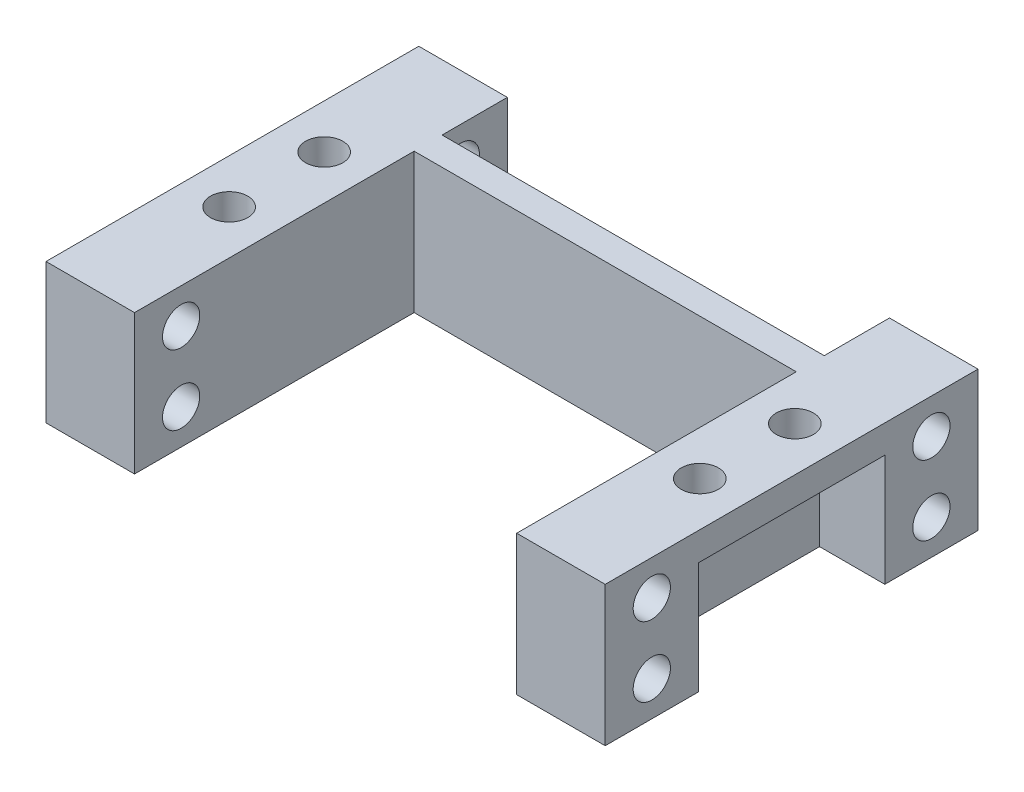
ISO-10303-21;
HEADER;
FILE_DESCRIPTION(('STEP AP214'),'2;1');
FILE_NAME('part.step','',(''),(''),'','','');
FILE_SCHEMA(('AUTOMOTIVE_DESIGN { 1 0 10303 214 1 1 1 1 }'));
ENDSEC;
DATA;
#1=APPLICATION_CONTEXT('core data for automotive mechanical design processes');
#2=APPLICATION_PROTOCOL_DEFINITION('international standard','automotive_design',2000,#1);
#3=PRODUCT_CONTEXT('',#1,'mechanical');
#4=PRODUCT('Part','Part','',(#3));
#5=PRODUCT_RELATED_PRODUCT_CATEGORY('part','',(#4));
#6=PRODUCT_DEFINITION_FORMATION('','',#4);
#7=PRODUCT_DEFINITION_CONTEXT('part definition',#1,'design');
#8=PRODUCT_DEFINITION('design','',#6,#7);
#9=PRODUCT_DEFINITION_SHAPE('','',#8);
#10=(LENGTH_UNIT() NAMED_UNIT(*) SI_UNIT(.MILLI.,.METRE.));
#11=(NAMED_UNIT(*) PLANE_ANGLE_UNIT() SI_UNIT($,.RADIAN.));
#12=(NAMED_UNIT(*) SI_UNIT($,.STERADIAN.) SOLID_ANGLE_UNIT());
#13=UNCERTAINTY_MEASURE_WITH_UNIT(LENGTH_MEASURE(1.E-05),#10,'distance_accuracy_value','');
#14=(GEOMETRIC_REPRESENTATION_CONTEXT(3) GLOBAL_UNCERTAINTY_ASSIGNED_CONTEXT((#13)) GLOBAL_UNIT_ASSIGNED_CONTEXT((#10,
#11,#12)) REPRESENTATION_CONTEXT('',''));
#15=CARTESIAN_POINT('',(0.,0.,0.));
#16=DIRECTION('',(0.,0.,1.));
#17=DIRECTION('',(1.,0.,0.));
#18=AXIS2_PLACEMENT_3D('',#15,#16,#17);
#19=CARTESIAN_POINT('',(0.,0.,0.));
#20=DIRECTION('',(0.,0.,-1.));
#21=DIRECTION('',(-1.,0.,0.));
#22=AXIS2_PLACEMENT_3D('',#19,#20,#21);
#23=PLANE('',#22);
#24=DIRECTION('',(0.,-1.,0.));
#25=VECTOR('',#24,1.);
#26=CARTESIAN_POINT('',(43.5,0.,0.));
#27=LINE('',#26,#25);
#28=CARTESIAN_POINT('',(43.5,15.,0.));
#29=VERTEX_POINT('',#28);
#30=CARTESIAN_POINT('',(43.5,11.25,0.));
#31=VERTEX_POINT('',#30);
#32=EDGE_CURVE('E11',#29,#31,#27,.T.);
#33=ORIENTED_EDGE('',*,*,#32,.T.);
#34=CARTESIAN_POINT('',(43.5,3.75,0.));
#35=VERTEX_POINT('',#34);
#36=EDGE_CURVE('E47',#31,#35,#27,.T.);
#37=ORIENTED_EDGE('',*,*,#36,.T.);
#38=CARTESIAN_POINT('',(43.5,0.,0.));
#39=VERTEX_POINT('',#38);
#40=EDGE_CURVE('E49',#35,#39,#27,.T.);
#41=ORIENTED_EDGE('',*,*,#40,.T.);
#42=DIRECTION('',(1.,0.,0.));
#43=VECTOR('',#42,1.);
#44=CARTESIAN_POINT('',(0.,0.,0.));
#45=LINE('',#44,#43);
#46=CARTESIAN_POINT('',(2.5,0.,0.));
#47=VERTEX_POINT('',#46);
#48=EDGE_CURVE('E381',#47,#39,#45,.T.);
#49=ORIENTED_EDGE('',*,*,#48,.F.);
#50=DIRECTION('',(0.,-1.,0.));
#51=VECTOR('',#50,1.);
#52=CARTESIAN_POINT('',(2.5,0.,0.));
#53=LINE('',#52,#51);
#54=CARTESIAN_POINT('',(2.5,3.75,0.));
#55=VERTEX_POINT('',#54);
#56=EDGE_CURVE('E395',#55,#47,#53,.T.);
#57=ORIENTED_EDGE('',*,*,#56,.F.);
#58=CARTESIAN_POINT('',(2.5,11.25,0.));
#59=VERTEX_POINT('',#58);
#60=EDGE_CURVE('E407',#59,#55,#53,.T.);
#61=ORIENTED_EDGE('',*,*,#60,.F.);
#62=CARTESIAN_POINT('',(2.5,15.,0.));
#63=VERTEX_POINT('',#62);
#64=EDGE_CURVE('E404',#63,#59,#53,.T.);
#65=ORIENTED_EDGE('',*,*,#64,.F.);
#66=DIRECTION('',(-1.,0.,0.));
#67=VECTOR('',#66,1.);
#68=CARTESIAN_POINT('',(0.,15.,0.));
#69=LINE('',#68,#67);
#70=EDGE_CURVE('E385',#29,#63,#69,.T.);
#71=ORIENTED_EDGE('',*,*,#70,.F.);
#72=EDGE_LOOP('',(#33,#37,#41,#49,#57,#61,#65,#71));
#73=FACE_BOUND('',#72,.T.);
#74=ADVANCED_FACE('F38',(#73),#23,.T.);
#75=CARTESIAN_POINT('',(0.,0.,3.));
#76=DIRECTION('',(1.,0.,0.));
#77=DIRECTION('',(0.,0.,-1.));
#78=AXIS2_PLACEMENT_3D('',#75,#76,#77);
#79=PLANE('',#78);
#80=DIRECTION('',(0.,0.,1.));
#81=VECTOR('',#80,1.);
#82=CARTESIAN_POINT('',(0.,12.,23.));
#83=LINE('',#82,#81);
#84=CARTESIAN_POINT('',(0.,12.,3.));
#85=VERTEX_POINT('',#84);
#86=CARTESIAN_POINT('',(0.,12.,23.));
#87=VERTEX_POINT('',#86);
#88=EDGE_CURVE('E359',#85,#87,#83,.T.);
#89=ORIENTED_EDGE('',*,*,#88,.F.);
#90=DIRECTION('',(0.,-1.,0.));
#91=VECTOR('',#90,1.);
#92=CARTESIAN_POINT('',(0.,0.,3.));
#93=LINE('',#92,#91);
#94=CARTESIAN_POINT('',(0.,0.,3.));
#95=VERTEX_POINT('',#94);
#96=EDGE_CURVE('E254',#85,#95,#93,.T.);
#97=ORIENTED_EDGE('',*,*,#96,.T.);
#98=DIRECTION('',(0.,0.,-1.));
#99=VECTOR('',#98,1.);
#100=CARTESIAN_POINT('',(0.,0.,3.));
#101=LINE('',#100,#99);
#102=CARTESIAN_POINT('',(0.,0.,23.));
#103=VERTEX_POINT('',#102);
#104=EDGE_CURVE('E392',#103,#95,#101,.T.);
#105=ORIENTED_EDGE('',*,*,#104,.F.);
#106=DIRECTION('',(0.,-1.,0.));
#107=VECTOR('',#106,1.);
#108=CARTESIAN_POINT('',(0.,0.,23.));
#109=LINE('',#108,#107);
#110=EDGE_CURVE('E371',#87,#103,#109,.T.);
#111=ORIENTED_EDGE('',*,*,#110,.F.);
#112=EDGE_LOOP('',(#89,#97,#105,#111));
#113=FACE_BOUND('',#112,.T.);
#114=ADVANCED_FACE('F40',(#113),#79,.F.);
#115=CARTESIAN_POINT('',(0.,0.,3.));
#116=DIRECTION('',(0.,0.,-1.));
#117=DIRECTION('',(-1.,0.,0.));
#118=AXIS2_PLACEMENT_3D('',#115,#116,#117);
#119=PLANE('',#118);
#120=DIRECTION('',(1.,0.,0.));
#121=VECTOR('',#120,1.);
#122=CARTESIAN_POINT('',(0.,0.,3.));
#123=LINE('',#122,#121);
#124=CARTESIAN_POINT('',(2.5,0.,3.));
#125=VERTEX_POINT('',#124);
#126=CARTESIAN_POINT('',(43.5,0.,3.));
#127=VERTEX_POINT('',#126);
#128=EDGE_CURVE('E382',#125,#127,#123,.T.);
#129=ORIENTED_EDGE('',*,*,#128,.T.);
#130=DIRECTION('',(0.,1.,0.));
#131=VECTOR('',#130,1.);
#132=CARTESIAN_POINT('',(43.5,0.,3.));
#133=LINE('',#132,#131);
#134=CARTESIAN_POINT('',(43.5,15.,3.));
#135=VERTEX_POINT('',#134);
#136=EDGE_CURVE('E338',#127,#135,#133,.T.);
#137=ORIENTED_EDGE('',*,*,#136,.T.);
#138=DIRECTION('',(-1.,0.,0.));
#139=VECTOR('',#138,1.);
#140=CARTESIAN_POINT('',(0.,15.,3.));
#141=LINE('',#140,#139);
#142=CARTESIAN_POINT('',(2.5,15.,3.));
#143=VERTEX_POINT('',#142);
#144=EDGE_CURVE('E384',#135,#143,#141,.T.);
#145=ORIENTED_EDGE('',*,*,#144,.T.);
#146=DIRECTION('',(0.,1.,0.));
#147=VECTOR('',#146,1.);
#148=CARTESIAN_POINT('',(2.5,0.,3.));
#149=LINE('',#148,#147);
#150=EDGE_CURVE('E370',#125,#143,#149,.T.);
#151=ORIENTED_EDGE('',*,*,#150,.F.);
#152=EDGE_LOOP('',(#129,#137,#145,#151));
#153=FACE_BOUND('',#152,.T.);
#154=ADVANCED_FACE('F458',(#153),#119,.F.);
#155=CARTESIAN_POINT('',(0.,0.,3.));
#156=DIRECTION('',(0.,1.,0.));
#157=DIRECTION('',(0.,0.,1.));
#158=AXIS2_PLACEMENT_3D('',#155,#156,#157);
#159=PLANE('',#158);
#160=DIRECTION('',(0.,0.,-1.));
#161=VECTOR('',#160,1.);
#162=CARTESIAN_POINT('',(43.5,0.,23.));
#163=LINE('',#162,#161);
#164=CARTESIAN_POINT('',(43.5,0.,33.));
#165=VERTEX_POINT('',#164);
#166=EDGE_CURVE('E341',#165,#127,#163,.T.);
#167=ORIENTED_EDGE('',*,*,#166,.T.);
#168=ORIENTED_EDGE('',*,*,#128,.F.);
#169=DIRECTION('',(0.,0.,-1.));
#170=VECTOR('',#169,1.);
#171=CARTESIAN_POINT('',(2.5,0.,23.));
#172=LINE('',#171,#170);
#173=CARTESIAN_POINT('',(2.5,0.,33.));
#174=VERTEX_POINT('',#173);
#175=EDGE_CURVE('E378',#174,#125,#172,.T.);
#176=ORIENTED_EDGE('',*,*,#175,.F.);
#177=DIRECTION('',(1.,0.,0.));
#178=VECTOR('',#177,1.);
#179=CARTESIAN_POINT('',(2.5,0.,33.));
#180=LINE('',#179,#178);
#181=CARTESIAN_POINT('',(-7.00000000000001,0.,33.));
#182=VERTEX_POINT('',#181);
#183=EDGE_CURVE('E310',#182,#174,#180,.T.);
#184=ORIENTED_EDGE('',*,*,#183,.F.);
#185=DIRECTION('',(0.,0.,-1.));
#186=VECTOR('',#185,1.);
#187=CARTESIAN_POINT('',(-7.00000000000001,0.,33.));
#188=LINE('',#187,#186);
#189=CARTESIAN_POINT('',(-7.00000000000001,0.,23.));
#190=VERTEX_POINT('',#189);
#191=EDGE_CURVE('E313',#182,#190,#188,.T.);
#192=ORIENTED_EDGE('',*,*,#191,.T.);
#193=DIRECTION('',(1.,0.,0.));
#194=VECTOR('',#193,1.);
#195=CARTESIAN_POINT('',(2.5,0.,23.));
#196=LINE('',#195,#194);
#197=EDGE_CURVE('E305',#190,#103,#196,.T.);
#198=ORIENTED_EDGE('',*,*,#197,.T.);
#199=ORIENTED_EDGE('',*,*,#104,.T.);
#200=DIRECTION('',(1.,0.,0.));
#201=VECTOR('',#200,1.);
#202=CARTESIAN_POINT('',(2.5,0.,3.));
#203=LINE('',#202,#201);
#204=CARTESIAN_POINT('',(-7.00000000000001,0.,3.));
#205=VERTEX_POINT('',#204);
#206=EDGE_CURVE('E242',#205,#95,#203,.T.);
#207=ORIENTED_EDGE('',*,*,#206,.F.);
#208=DIRECTION('',(0.,0.,1.));
#209=VECTOR('',#208,1.);
#210=CARTESIAN_POINT('',(-7.00000000000001,0.,-7.));
#211=LINE('',#210,#209);
#212=CARTESIAN_POINT('',(-7.00000000000001,0.,-7.));
#213=VERTEX_POINT('',#212);
#214=EDGE_CURVE('E248',#213,#205,#211,.T.);
#215=ORIENTED_EDGE('',*,*,#214,.F.);
#216=DIRECTION('',(1.,0.,0.));
#217=VECTOR('',#216,1.);
#218=CARTESIAN_POINT('',(2.5,0.,-7.));
#219=LINE('',#218,#217);
#220=CARTESIAN_POINT('',(2.5,0.,-7.));
#221=VERTEX_POINT('',#220);
#222=EDGE_CURVE('E231',#213,#221,#219,.T.);
#223=ORIENTED_EDGE('',*,*,#222,.T.);
#224=DIRECTION('',(0.,0.,1.));
#225=VECTOR('',#224,1.);
#226=CARTESIAN_POINT('',(2.5,0.,-7.));
#227=LINE('',#226,#225);
#228=EDGE_CURVE('E251',#221,#47,#227,.T.);
#229=ORIENTED_EDGE('',*,*,#228,.T.);
#230=ORIENTED_EDGE('',*,*,#48,.T.);
#231=DIRECTION('',(0.,0.,1.));
#232=VECTOR('',#231,1.);
#233=CARTESIAN_POINT('',(43.5,0.,-7.));
#234=LINE('',#233,#232);
#235=CARTESIAN_POINT('',(43.5,0.,-7.));
#236=VERTEX_POINT('',#235);
#237=EDGE_CURVE('E218',#236,#39,#234,.T.);
#238=ORIENTED_EDGE('',*,*,#237,.F.);
#239=DIRECTION('',(-1.,0.,0.));
#240=VECTOR('',#239,1.);
#241=CARTESIAN_POINT('',(43.5,0.,-7.));
#242=LINE('',#241,#240);
#243=CARTESIAN_POINT('',(53.,0.,-7.));
#244=VERTEX_POINT('',#243);
#245=EDGE_CURVE('E203',#244,#236,#242,.T.);
#246=ORIENTED_EDGE('',*,*,#245,.F.);
#247=DIRECTION('',(0.,0.,1.));
#248=VECTOR('',#247,1.);
#249=CARTESIAN_POINT('',(53.,0.,-7.));
#250=LINE('',#249,#248);
#251=CARTESIAN_POINT('',(53.,0.,3.));
#252=VERTEX_POINT('',#251);
#253=EDGE_CURVE('E213',#244,#252,#250,.T.);
#254=ORIENTED_EDGE('',*,*,#253,.T.);
#255=DIRECTION('',(-1.,0.,0.));
#256=VECTOR('',#255,1.);
#257=CARTESIAN_POINT('',(43.5,0.,3.));
#258=LINE('',#257,#256);
#259=CARTESIAN_POINT('',(46.,0.,3.));
#260=VERTEX_POINT('',#259);
#261=EDGE_CURVE('E207',#252,#260,#258,.T.);
#262=ORIENTED_EDGE('',*,*,#261,.T.);
#263=DIRECTION('',(0.,0.,-1.));
#264=VECTOR('',#263,1.);
#265=CARTESIAN_POINT('',(46.,0.,3.));
#266=LINE('',#265,#264);
#267=CARTESIAN_POINT('',(46.,0.,23.));
#268=VERTEX_POINT('',#267);
#269=EDGE_CURVE('E387',#268,#260,#266,.T.);
#270=ORIENTED_EDGE('',*,*,#269,.F.);
#271=DIRECTION('',(-1.,0.,0.));
#272=VECTOR('',#271,1.);
#273=CARTESIAN_POINT('',(43.5,0.,23.));
#274=LINE('',#273,#272);
#275=CARTESIAN_POINT('',(53.,0.,23.));
#276=VERTEX_POINT('',#275);
#277=EDGE_CURVE('E269',#276,#268,#274,.T.);
#278=ORIENTED_EDGE('',*,*,#277,.F.);
#279=DIRECTION('',(0.,0.,-1.));
#280=VECTOR('',#279,1.);
#281=CARTESIAN_POINT('',(53.,0.,33.));
#282=LINE('',#281,#280);
#283=CARTESIAN_POINT('',(53.,0.,33.));
#284=VERTEX_POINT('',#283);
#285=EDGE_CURVE('E282',#284,#276,#282,.T.);
#286=ORIENTED_EDGE('',*,*,#285,.F.);
#287=DIRECTION('',(-1.,0.,0.));
#288=VECTOR('',#287,1.);
#289=CARTESIAN_POINT('',(43.5,0.,33.));
#290=LINE('',#289,#288);
#291=EDGE_CURVE('E273',#284,#165,#290,.T.);
#292=ORIENTED_EDGE('',*,*,#291,.T.);
#293=EDGE_LOOP('',(#167,#168,#176,#184,#192,#198,#199,#207,#215,#223,#229,#230,#238,#246,#254,
#262,#270,#278,#286,#292));
#294=FACE_BOUND('',#293,.T.);
#295=ADVANCED_FACE('F428',(#294),#159,.F.);
#296=CARTESIAN_POINT('',(46.,0.,3.));
#297=DIRECTION('',(-1.,0.,0.));
#298=DIRECTION('',(0.,0.,1.));
#299=AXIS2_PLACEMENT_3D('',#296,#297,#298);
#300=PLANE('',#299);
#301=ORIENTED_EDGE('',*,*,#269,.T.);
#302=DIRECTION('',(0.,1.,0.));
#303=VECTOR('',#302,1.);
#304=CARTESIAN_POINT('',(46.,0.,3.));
#305=LINE('',#304,#303);
#306=CARTESIAN_POINT('',(46.,12.,3.));
#307=VERTEX_POINT('',#306);
#308=EDGE_CURVE('E212',#260,#307,#305,.T.);
#309=ORIENTED_EDGE('',*,*,#308,.T.);
#310=DIRECTION('',(0.,0.,1.));
#311=VECTOR('',#310,1.);
#312=CARTESIAN_POINT('',(46.,12.,23.));
#313=LINE('',#312,#311);
#314=CARTESIAN_POINT('',(46.,12.,23.));
#315=VERTEX_POINT('',#314);
#316=EDGE_CURVE('E328',#307,#315,#313,.T.);
#317=ORIENTED_EDGE('',*,*,#316,.T.);
#318=DIRECTION('',(0.,-1.,0.));
#319=VECTOR('',#318,1.);
#320=CARTESIAN_POINT('',(46.,0.,23.));
#321=LINE('',#320,#319);
#322=EDGE_CURVE('E339',#315,#268,#321,.T.);
#323=ORIENTED_EDGE('',*,*,#322,.T.);
#324=EDGE_LOOP('',(#301,#309,#317,#323));
#325=FACE_BOUND('',#324,.T.);
#326=ADVANCED_FACE('F481',(#325),#300,.F.);
#327=CARTESIAN_POINT('',(0.,15.,3.));
#328=DIRECTION('',(0.,-1.,0.));
#329=DIRECTION('',(0.,0.,-1.));
#330=AXIS2_PLACEMENT_3D('',#327,#328,#329);
#331=PLANE('',#330);
#332=DIRECTION('',(0.,0.,1.));
#333=VECTOR('',#332,1.);
#334=CARTESIAN_POINT('',(43.5,15.,-7.));
#335=LINE('',#334,#333);
#336=CARTESIAN_POINT('',(43.5,15.,-7.));
#337=VERTEX_POINT('',#336);
#338=EDGE_CURVE('E192',#337,#29,#335,.T.);
#339=ORIENTED_EDGE('',*,*,#338,.T.);
#340=ORIENTED_EDGE('',*,*,#70,.T.);
#341=DIRECTION('',(0.,0.,1.));
#342=VECTOR('',#341,1.);
#343=CARTESIAN_POINT('',(2.5,15.,-7.));
#344=LINE('',#343,#342);
#345=CARTESIAN_POINT('',(2.5,15.,-7.));
#346=VERTEX_POINT('',#345);
#347=EDGE_CURVE('E241',#346,#63,#344,.T.);
#348=ORIENTED_EDGE('',*,*,#347,.F.);
#349=DIRECTION('',(-1.,0.,0.));
#350=VECTOR('',#349,1.);
#351=CARTESIAN_POINT('',(2.5,15.,-7.));
#352=LINE('',#351,#350);
#353=CARTESIAN_POINT('',(-7.00000000000001,15.,-7.));
#354=VERTEX_POINT('',#353);
#355=EDGE_CURVE('E238',#346,#354,#352,.T.);
#356=ORIENTED_EDGE('',*,*,#355,.T.);
#357=DIRECTION('',(0.,0.,-1.));
#358=VECTOR('',#357,1.);
#359=CARTESIAN_POINT('',(-7.,15.,23.));
#360=LINE('',#359,#358);
#361=CARTESIAN_POINT('',(-7.00000000000001,15.,33.));
#362=VERTEX_POINT('',#361);
#363=EDGE_CURVE('E356',#362,#354,#360,.T.);
#364=ORIENTED_EDGE('',*,*,#363,.F.);
#365=DIRECTION('',(-1.,0.,0.));
#366=VECTOR('',#365,1.);
#367=CARTESIAN_POINT('',(2.5,15.,33.));
#368=LINE('',#367,#366);
#369=CARTESIAN_POINT('',(2.5,15.,33.));
#370=VERTEX_POINT('',#369);
#371=EDGE_CURVE('E304',#370,#362,#368,.T.);
#372=ORIENTED_EDGE('',*,*,#371,.F.);
#373=DIRECTION('',(0.,0.,-1.));
#374=VECTOR('',#373,1.);
#375=CARTESIAN_POINT('',(2.5,15.,23.));
#376=LINE('',#375,#374);
#377=EDGE_CURVE('E373',#370,#143,#376,.T.);
#378=ORIENTED_EDGE('',*,*,#377,.T.);
#379=ORIENTED_EDGE('',*,*,#144,.F.);
#380=DIRECTION('',(0.,0.,-1.));
#381=VECTOR('',#380,1.);
#382=CARTESIAN_POINT('',(43.5,15.,23.));
#383=LINE('',#382,#381);
#384=CARTESIAN_POINT('',(43.5,15.,33.));
#385=VERTEX_POINT('',#384);
#386=EDGE_CURVE('E346',#385,#135,#383,.T.);
#387=ORIENTED_EDGE('',*,*,#386,.F.);
#388=DIRECTION('',(1.,0.,0.));
#389=VECTOR('',#388,1.);
#390=CARTESIAN_POINT('',(43.5,15.,33.));
#391=LINE('',#390,#389);
#392=CARTESIAN_POINT('',(53.,15.,33.));
#393=VERTEX_POINT('',#392);
#394=EDGE_CURVE('E280',#385,#393,#391,.T.);
#395=ORIENTED_EDGE('',*,*,#394,.T.);
#396=DIRECTION('',(0.,0.,-1.));
#397=VECTOR('',#396,1.);
#398=CARTESIAN_POINT('',(53.,15.,23.));
#399=LINE('',#398,#397);
#400=CARTESIAN_POINT('',(53.,15.,-7.));
#401=VERTEX_POINT('',#400);
#402=EDGE_CURVE('E194',#393,#401,#399,.T.);
#403=ORIENTED_EDGE('',*,*,#402,.T.);
#404=DIRECTION('',(1.,0.,0.));
#405=VECTOR('',#404,1.);
#406=CARTESIAN_POINT('',(43.5,15.,-7.));
#407=LINE('',#406,#405);
#408=EDGE_CURVE('E187',#337,#401,#407,.T.);
#409=ORIENTED_EDGE('',*,*,#408,.F.);
#410=EDGE_LOOP('',(#339,#340,#348,#356,#364,#372,#378,#379,#387,#395,#403,#409));
#411=FACE_BOUND('',#410,.T.);
#412=CARTESIAN_POINT('',(48.25,15.,7.9));
#413=DIRECTION('',(0.,-1.,0.));
#414=DIRECTION('',(0.,0.,-1.));
#415=AXIS2_PLACEMENT_3D('',#412,#413,#414);
#416=CIRCLE('',#415,2.);
#417=CARTESIAN_POINT('',(48.25,15.,5.9));
#418=VERTEX_POINT('',#417);
#419=EDGE_CURVE('E319',#418,#418,#416,.T.);
#420=ORIENTED_EDGE('',*,*,#419,.T.);
#421=EDGE_LOOP('',(#420));
#422=FACE_BOUND('',#421,.T.);
#423=CARTESIAN_POINT('',(48.25,15.,18.1));
#424=DIRECTION('',(0.,-1.,0.));
#425=DIRECTION('',(0.,0.,1.));
#426=AXIS2_PLACEMENT_3D('',#423,#424,#425);
#427=CIRCLE('',#426,2.);
#428=CARTESIAN_POINT('',(48.25,15.,20.1));
#429=VERTEX_POINT('',#428);
#430=EDGE_CURVE('E320',#429,#429,#427,.T.);
#431=ORIENTED_EDGE('',*,*,#430,.T.);
#432=EDGE_LOOP('',(#431));
#433=FACE_BOUND('',#432,.T.);
#434=CARTESIAN_POINT('',(-2.25,15.,18.1));
#435=DIRECTION('',(0.,1.,0.));
#436=DIRECTION('',(0.,0.,1.));
#437=AXIS2_PLACEMENT_3D('',#434,#435,#436);
#438=CIRCLE('',#437,2.);
#439=CARTESIAN_POINT('',(-2.25,15.,20.1));
#440=VERTEX_POINT('',#439);
#441=EDGE_CURVE('E350',#440,#440,#438,.T.);
#442=ORIENTED_EDGE('',*,*,#441,.F.);
#443=EDGE_LOOP('',(#442));
#444=FACE_BOUND('',#443,.T.);
#445=CARTESIAN_POINT('',(-2.25,15.,7.9));
#446=DIRECTION('',(0.,1.,0.));
#447=DIRECTION('',(0.,0.,-1.));
#448=AXIS2_PLACEMENT_3D('',#445,#446,#447);
#449=CIRCLE('',#448,2.);
#450=CARTESIAN_POINT('',(-2.25,15.,5.9));
#451=VERTEX_POINT('',#450);
#452=EDGE_CURVE('E349',#451,#451,#449,.T.);
#453=ORIENTED_EDGE('',*,*,#452,.F.);
#454=EDGE_LOOP('',(#453));
#455=FACE_BOUND('',#454,.T.);
#456=ADVANCED_FACE('F189',(#411,#422,#433,#444,#455),#331,.F.);
#457=CARTESIAN_POINT('',(2.5,0.,23.));
#458=DIRECTION('',(-1.,0.,0.));
#459=DIRECTION('',(0.,0.,1.));
#460=AXIS2_PLACEMENT_3D('',#457,#458,#459);
#461=PLANE('',#460);
#462=CARTESIAN_POINT('',(2.5,11.25,28.));
#463=DIRECTION('',(-1.,0.,0.));
#464=DIRECTION('',(0.,0.,1.));
#465=AXIS2_PLACEMENT_3D('',#462,#463,#464);
#466=CIRCLE('',#465,2.);
#467=CARTESIAN_POINT('',(2.5,11.25,30.));
#468=VERTEX_POINT('',#467);
#469=EDGE_CURVE('E297',#468,#468,#466,.T.);
#470=ORIENTED_EDGE('',*,*,#469,.T.);
#471=EDGE_LOOP('',(#470));
#472=FACE_BOUND('',#471,.T.);
#473=CARTESIAN_POINT('',(2.5,3.75,28.));
#474=DIRECTION('',(-1.,0.,0.));
#475=DIRECTION('',(0.,0.,1.));
#476=AXIS2_PLACEMENT_3D('',#473,#474,#475);
#477=CIRCLE('',#476,2.);
#478=CARTESIAN_POINT('',(2.5,3.75,30.));
#479=VERTEX_POINT('',#478);
#480=EDGE_CURVE('E292',#479,#479,#477,.T.);
#481=ORIENTED_EDGE('',*,*,#480,.T.);
#482=EDGE_LOOP('',(#481));
#483=FACE_BOUND('',#482,.T.);
#484=ORIENTED_EDGE('',*,*,#150,.T.);
#485=ORIENTED_EDGE('',*,*,#377,.F.);
#486=DIRECTION('',(0.,1.,0.));
#487=VECTOR('',#486,1.);
#488=CARTESIAN_POINT('',(2.5,15.,33.));
#489=LINE('',#488,#487);
#490=EDGE_CURVE('E301',#174,#370,#489,.T.);
#491=ORIENTED_EDGE('',*,*,#490,.F.);
#492=ORIENTED_EDGE('',*,*,#175,.T.);
#493=EDGE_LOOP('',(#484,#485,#491,#492));
#494=FACE_BOUND('',#493,.T.);
#495=ADVANCED_FACE('F455',(#472,#483,#494),#461,.F.);
#496=CARTESIAN_POINT('',(-7.,12.,23.));
#497=DIRECTION('',(0.,1.,0.));
#498=DIRECTION('',(0.,0.,1.));
#499=AXIS2_PLACEMENT_3D('',#496,#497,#498);
#500=PLANE('',#499);
#501=CARTESIAN_POINT('',(-2.25,12.,18.1));
#502=DIRECTION('',(0.,1.,0.));
#503=DIRECTION('',(0.,0.,1.));
#504=AXIS2_PLACEMENT_3D('',#501,#502,#503);
#505=CIRCLE('',#504,2.);
#506=CARTESIAN_POINT('',(-2.25,12.,20.1));
#507=VERTEX_POINT('',#506);
#508=EDGE_CURVE('E365',#507,#507,#505,.T.);
#509=ORIENTED_EDGE('',*,*,#508,.T.);
#510=EDGE_LOOP('',(#509));
#511=FACE_BOUND('',#510,.T.);
#512=CARTESIAN_POINT('',(-2.25,12.,7.9));
#513=DIRECTION('',(0.,1.,0.));
#514=DIRECTION('',(0.,0.,1.));
#515=AXIS2_PLACEMENT_3D('',#512,#513,#514);
#516=CIRCLE('',#515,2.);
#517=CARTESIAN_POINT('',(-2.25,12.,9.9));
#518=VERTEX_POINT('',#517);
#519=EDGE_CURVE('E353',#518,#518,#516,.T.);
#520=ORIENTED_EDGE('',*,*,#519,.T.);
#521=EDGE_LOOP('',(#520));
#522=FACE_BOUND('',#521,.T.);
#523=ORIENTED_EDGE('',*,*,#88,.T.);
#524=DIRECTION('',(1.,0.,0.));
#525=VECTOR('',#524,1.);
#526=CARTESIAN_POINT('',(-7.,12.,23.));
#527=LINE('',#526,#525);
#528=CARTESIAN_POINT('',(-7.00000000000001,12.,23.));
#529=VERTEX_POINT('',#528);
#530=EDGE_CURVE('E362',#529,#87,#527,.T.);
#531=ORIENTED_EDGE('',*,*,#530,.F.);
#532=DIRECTION('',(0.,0.,1.));
#533=VECTOR('',#532,1.);
#534=CARTESIAN_POINT('',(-7.,12.,23.));
#535=LINE('',#534,#533);
#536=CARTESIAN_POINT('',(-7.,12.,3.));
#537=VERTEX_POINT('',#536);
#538=EDGE_CURVE('E358',#537,#529,#535,.T.);
#539=ORIENTED_EDGE('',*,*,#538,.F.);
#540=DIRECTION('',(1.,0.,0.));
#541=VECTOR('',#540,1.);
#542=CARTESIAN_POINT('',(-7.,12.,3.));
#543=LINE('',#542,#541);
#544=EDGE_CURVE('E367',#537,#85,#543,.T.);
#545=ORIENTED_EDGE('',*,*,#544,.T.);
#546=EDGE_LOOP('',(#523,#531,#539,#545));
#547=FACE_BOUND('',#546,.T.);
#548=ADVANCED_FACE('F571',(#511,#522,#547),#500,.F.);
#549=CARTESIAN_POINT('',(-7.,0.,0.));
#550=DIRECTION('',(1.,0.,0.));
#551=DIRECTION('',(0.,0.,-1.));
#552=AXIS2_PLACEMENT_3D('',#549,#550,#551);
#553=PLANE('',#552);
#554=CARTESIAN_POINT('',(-7.,11.25,-2.));
#555=DIRECTION('',(1.,0.,0.));
#556=DIRECTION('',(0.,0.,-1.));
#557=AXIS2_PLACEMENT_3D('',#554,#555,#556);
#558=CIRCLE('',#557,2.);
#559=CARTESIAN_POINT('',(-7.,11.25,-4.));
#560=VERTEX_POINT('',#559);
#561=EDGE_CURVE('E222',#560,#560,#558,.T.);
#562=ORIENTED_EDGE('',*,*,#561,.T.);
#563=EDGE_LOOP('',(#562));
#564=FACE_BOUND('',#563,.T.);
#565=CARTESIAN_POINT('',(-7.,3.75,-2.));
#566=DIRECTION('',(1.,0.,0.));
#567=DIRECTION('',(0.,0.,1.));
#568=AXIS2_PLACEMENT_3D('',#565,#566,#567);
#569=CIRCLE('',#568,2.);
#570=CARTESIAN_POINT('',(-7.,3.75,0.));
#571=VERTEX_POINT('',#570);
#572=EDGE_CURVE('E215',#571,#571,#569,.T.);
#573=ORIENTED_EDGE('',*,*,#572,.T.);
#574=EDGE_LOOP('',(#573));
#575=FACE_BOUND('',#574,.T.);
#576=CARTESIAN_POINT('',(-7.,11.25,28.));
#577=DIRECTION('',(-1.,0.,0.));
#578=DIRECTION('',(0.,0.,1.));
#579=AXIS2_PLACEMENT_3D('',#576,#577,#578);
#580=CIRCLE('',#579,2.);
#581=CARTESIAN_POINT('',(-7.,11.25,30.));
#582=VERTEX_POINT('',#581);
#583=EDGE_CURVE('E289',#582,#582,#580,.T.);
#584=ORIENTED_EDGE('',*,*,#583,.F.);
#585=EDGE_LOOP('',(#584));
#586=FACE_BOUND('',#585,.T.);
#587=CARTESIAN_POINT('',(-7.,3.75,28.));
#588=DIRECTION('',(-1.,0.,0.));
#589=DIRECTION('',(0.,0.,-1.));
#590=AXIS2_PLACEMENT_3D('',#587,#588,#589);
#591=CIRCLE('',#590,2.);
#592=CARTESIAN_POINT('',(-7.,3.75,26.));
#593=VERTEX_POINT('',#592);
#594=EDGE_CURVE('E288',#593,#593,#591,.T.);
#595=ORIENTED_EDGE('',*,*,#594,.F.);
#596=EDGE_LOOP('',(#595));
#597=FACE_BOUND('',#596,.T.);
#598=ORIENTED_EDGE('',*,*,#538,.T.);
#599=DIRECTION('',(0.,-1.,0.));
#600=VECTOR('',#599,1.);
#601=CARTESIAN_POINT('',(-7.00000000000001,15.,23.));
#602=LINE('',#601,#600);
#603=EDGE_CURVE('E300',#529,#190,#602,.T.);
#604=ORIENTED_EDGE('',*,*,#603,.T.);
#605=ORIENTED_EDGE('',*,*,#191,.F.);
#606=DIRECTION('',(0.,-1.,0.));
#607=VECTOR('',#606,1.);
#608=CARTESIAN_POINT('',(-7.00000000000001,15.,33.));
#609=LINE('',#608,#607);
#610=EDGE_CURVE('E308',#362,#182,#609,.T.);
#611=ORIENTED_EDGE('',*,*,#610,.F.);
#612=ORIENTED_EDGE('',*,*,#363,.T.);
#613=DIRECTION('',(0.,-1.,0.));
#614=VECTOR('',#613,1.);
#615=CARTESIAN_POINT('',(-7.00000000000001,15.,-7.));
#616=LINE('',#615,#614);
#617=EDGE_CURVE('E235',#354,#213,#616,.T.);
#618=ORIENTED_EDGE('',*,*,#617,.T.);
#619=ORIENTED_EDGE('',*,*,#214,.T.);
#620=DIRECTION('',(0.,-1.,0.));
#621=VECTOR('',#620,1.);
#622=CARTESIAN_POINT('',(-7.00000000000001,15.,3.));
#623=LINE('',#622,#621);
#624=EDGE_CURVE('E232',#537,#205,#623,.T.);
#625=ORIENTED_EDGE('',*,*,#624,.F.);
#626=EDGE_LOOP('',(#598,#604,#605,#611,#612,#618,#619,#625));
#627=FACE_BOUND('',#626,.T.);
#628=ADVANCED_FACE('F450',(#564,#575,#586,#597,#627),#553,.F.);
#629=CARTESIAN_POINT('',(-2.25,8.,7.9));
#630=DIRECTION('',(0.,1.,0.));
#631=DIRECTION('',(0.,0.,1.));
#632=AXIS2_PLACEMENT_3D('',#629,#630,#631);
#633=CYLINDRICAL_SURFACE('',#632,2.);
#634=ORIENTED_EDGE('',*,*,#452,.T.);
#635=EDGE_LOOP('',(#634));
#636=FACE_BOUND('',#635,.T.);
#637=ORIENTED_EDGE('',*,*,#519,.F.);
#638=EDGE_LOOP('',(#637));
#639=FACE_BOUND('',#638,.T.);
#640=ADVANCED_FACE('F667',(#636,#639),#633,.F.);
#641=CARTESIAN_POINT('',(-2.25,8.,18.1));
#642=DIRECTION('',(0.,1.,0.));
#643=DIRECTION('',(0.,0.,1.));
#644=AXIS2_PLACEMENT_3D('',#641,#642,#643);
#645=CYLINDRICAL_SURFACE('',#644,2.);
#646=ORIENTED_EDGE('',*,*,#441,.T.);
#647=EDGE_LOOP('',(#646));
#648=FACE_BOUND('',#647,.T.);
#649=ORIENTED_EDGE('',*,*,#508,.F.);
#650=EDGE_LOOP('',(#649));
#651=FACE_BOUND('',#650,.T.);
#652=ADVANCED_FACE('F526',(#648,#651),#645,.F.);
#653=CARTESIAN_POINT('',(43.5,0.,23.));
#654=DIRECTION('',(-1.,0.,0.));
#655=DIRECTION('',(0.,0.,1.));
#656=AXIS2_PLACEMENT_3D('',#653,#654,#655);
#657=PLANE('',#656);
#658=CARTESIAN_POINT('',(43.5,11.25,28.));
#659=DIRECTION('',(-1.,0.,0.));
#660=DIRECTION('',(0.,0.,1.));
#661=AXIS2_PLACEMENT_3D('',#658,#659,#660);
#662=CIRCLE('',#661,2.);
#663=CARTESIAN_POINT('',(43.5,11.25,30.));
#664=VERTEX_POINT('',#663);
#665=EDGE_CURVE('E266',#664,#664,#662,.F.);
#666=ORIENTED_EDGE('',*,*,#665,.T.);
#667=EDGE_LOOP('',(#666));
#668=FACE_BOUND('',#667,.T.);
#669=CARTESIAN_POINT('',(43.5,3.75,28.));
#670=DIRECTION('',(-1.,0.,0.));
#671=DIRECTION('',(0.,0.,1.));
#672=AXIS2_PLACEMENT_3D('',#669,#670,#671);
#673=CIRCLE('',#672,2.);
#674=CARTESIAN_POINT('',(43.5,3.75,30.));
#675=VERTEX_POINT('',#674);
#676=EDGE_CURVE('E261',#675,#675,#673,.F.);
#677=ORIENTED_EDGE('',*,*,#676,.T.);
#678=EDGE_LOOP('',(#677));
#679=FACE_BOUND('',#678,.T.);
#680=ORIENTED_EDGE('',*,*,#136,.F.);
#681=ORIENTED_EDGE('',*,*,#166,.F.);
#682=DIRECTION('',(0.,1.,0.));
#683=VECTOR('',#682,1.);
#684=CARTESIAN_POINT('',(43.5,15.,33.));
#685=LINE('',#684,#683);
#686=EDGE_CURVE('E270',#165,#385,#685,.T.);
#687=ORIENTED_EDGE('',*,*,#686,.T.);
#688=ORIENTED_EDGE('',*,*,#386,.T.);
#689=EDGE_LOOP('',(#680,#681,#687,#688));
#690=FACE_BOUND('',#689,.T.);
#691=ADVANCED_FACE('F460',(#668,#679,#690),#657,.T.);
#692=CARTESIAN_POINT('',(53.,12.,23.));
#693=DIRECTION('',(0.,-1.,0.));
#694=DIRECTION('',(0.,0.,-1.));
#695=AXIS2_PLACEMENT_3D('',#692,#693,#694);
#696=PLANE('',#695);
#697=CARTESIAN_POINT('',(48.25,12.,18.1));
#698=DIRECTION('',(0.,-1.,0.));
#699=DIRECTION('',(0.,0.,-1.));
#700=AXIS2_PLACEMENT_3D('',#697,#698,#699);
#701=CIRCLE('',#700,2.);
#702=CARTESIAN_POINT('',(48.25,12.,16.1));
#703=VERTEX_POINT('',#702);
#704=EDGE_CURVE('E333',#703,#703,#701,.F.);
#705=ORIENTED_EDGE('',*,*,#704,.T.);
#706=EDGE_LOOP('',(#705));
#707=FACE_BOUND('',#706,.T.);
#708=CARTESIAN_POINT('',(48.25,12.,7.9));
#709=DIRECTION('',(0.,-1.,0.));
#710=DIRECTION('',(0.,0.,-1.));
#711=AXIS2_PLACEMENT_3D('',#708,#709,#710);
#712=CIRCLE('',#711,2.);
#713=CARTESIAN_POINT('',(48.25,12.,5.9));
#714=VERTEX_POINT('',#713);
#715=EDGE_CURVE('E323',#714,#714,#712,.F.);
#716=ORIENTED_EDGE('',*,*,#715,.T.);
#717=EDGE_LOOP('',(#716));
#718=FACE_BOUND('',#717,.T.);
#719=ORIENTED_EDGE('',*,*,#316,.F.);
#720=DIRECTION('',(-1.,0.,0.));
#721=VECTOR('',#720,1.);
#722=CARTESIAN_POINT('',(53.,12.,3.));
#723=LINE('',#722,#721);
#724=CARTESIAN_POINT('',(53.,12.,3.));
#725=VERTEX_POINT('',#724);
#726=EDGE_CURVE('E330',#725,#307,#723,.T.);
#727=ORIENTED_EDGE('',*,*,#726,.F.);
#728=DIRECTION('',(0.,0.,1.));
#729=VECTOR('',#728,1.);
#730=CARTESIAN_POINT('',(53.,12.,23.));
#731=LINE('',#730,#729);
#732=CARTESIAN_POINT('',(53.,12.,23.));
#733=VERTEX_POINT('',#732);
#734=EDGE_CURVE('E326',#725,#733,#731,.T.);
#735=ORIENTED_EDGE('',*,*,#734,.T.);
#736=DIRECTION('',(-1.,0.,0.));
#737=VECTOR('',#736,1.);
#738=CARTESIAN_POINT('',(53.,12.,23.));
#739=LINE('',#738,#737);
#740=EDGE_CURVE('E336',#733,#315,#739,.T.);
#741=ORIENTED_EDGE('',*,*,#740,.T.);
#742=EDGE_LOOP('',(#719,#727,#735,#741));
#743=FACE_BOUND('',#742,.T.);
#744=ADVANCED_FACE('F484',(#707,#718,#743),#696,.T.);
#745=CARTESIAN_POINT('',(53.,0.,0.));
#746=DIRECTION('',(-1.,0.,0.));
#747=DIRECTION('',(0.,0.,-1.));
#748=AXIS2_PLACEMENT_3D('',#745,#746,#747);
#749=PLANE('',#748);
#750=CARTESIAN_POINT('',(53.,11.25,-2.));
#751=DIRECTION('',(1.,0.,0.));
#752=DIRECTION('',(0.,0.,-1.));
#753=AXIS2_PLACEMENT_3D('',#750,#751,#752);
#754=CIRCLE('',#753,2.);
#755=CARTESIAN_POINT('',(53.,11.25,-4.));
#756=VERTEX_POINT('',#755);
#757=EDGE_CURVE('E411',#756,#756,#754,.T.);
#758=ORIENTED_EDGE('',*,*,#757,.F.);
#759=EDGE_LOOP('',(#758));
#760=FACE_BOUND('',#759,.T.);
#761=CARTESIAN_POINT('',(53.,3.75,-2.));
#762=DIRECTION('',(1.,0.,0.));
#763=DIRECTION('',(0.,0.,1.));
#764=AXIS2_PLACEMENT_3D('',#761,#762,#763);
#765=CIRCLE('',#764,2.);
#766=CARTESIAN_POINT('',(53.,3.75,0.));
#767=VERTEX_POINT('',#766);
#768=EDGE_CURVE('E415',#767,#767,#765,.T.);
#769=ORIENTED_EDGE('',*,*,#768,.F.);
#770=EDGE_LOOP('',(#769));
#771=FACE_BOUND('',#770,.T.);
#772=CARTESIAN_POINT('',(53.,11.25,28.));
#773=DIRECTION('',(-1.,0.,0.));
#774=DIRECTION('',(0.,0.,1.));
#775=AXIS2_PLACEMENT_3D('',#772,#773,#774);
#776=CIRCLE('',#775,2.);
#777=CARTESIAN_POINT('',(53.,11.25,30.));
#778=VERTEX_POINT('',#777);
#779=EDGE_CURVE('E258',#778,#778,#776,.T.);
#780=ORIENTED_EDGE('',*,*,#779,.T.);
#781=EDGE_LOOP('',(#780));
#782=FACE_BOUND('',#781,.T.);
#783=CARTESIAN_POINT('',(53.,3.75,28.));
#784=DIRECTION('',(-1.,0.,0.));
#785=DIRECTION('',(0.,0.,-1.));
#786=AXIS2_PLACEMENT_3D('',#783,#784,#785);
#787=CIRCLE('',#786,2.);
#788=CARTESIAN_POINT('',(53.,3.75,26.));
#789=VERTEX_POINT('',#788);
#790=EDGE_CURVE('E257',#789,#789,#787,.T.);
#791=ORIENTED_EDGE('',*,*,#790,.T.);
#792=EDGE_LOOP('',(#791));
#793=FACE_BOUND('',#792,.T.);
#794=ORIENTED_EDGE('',*,*,#402,.F.);
#795=DIRECTION('',(0.,-1.,0.));
#796=VECTOR('',#795,1.);
#797=CARTESIAN_POINT('',(53.,15.,33.));
#798=LINE('',#797,#796);
#799=EDGE_CURVE('E277',#393,#284,#798,.T.);
#800=ORIENTED_EDGE('',*,*,#799,.T.);
#801=ORIENTED_EDGE('',*,*,#285,.T.);
#802=DIRECTION('',(0.,-1.,0.));
#803=VECTOR('',#802,1.);
#804=CARTESIAN_POINT('',(53.,15.,23.));
#805=LINE('',#804,#803);
#806=EDGE_CURVE('E274',#733,#276,#805,.T.);
#807=ORIENTED_EDGE('',*,*,#806,.F.);
#808=ORIENTED_EDGE('',*,*,#734,.F.);
#809=DIRECTION('',(0.,-1.,0.));
#810=VECTOR('',#809,1.);
#811=CARTESIAN_POINT('',(53.,15.,3.));
#812=LINE('',#811,#810);
#813=EDGE_CURVE('E413',#725,#252,#812,.T.);
#814=ORIENTED_EDGE('',*,*,#813,.T.);
#815=ORIENTED_EDGE('',*,*,#253,.F.);
#816=DIRECTION('',(0.,-1.,0.));
#817=VECTOR('',#816,1.);
#818=CARTESIAN_POINT('',(53.,15.,-7.));
#819=LINE('',#818,#817);
#820=EDGE_CURVE('E197',#401,#244,#819,.T.);
#821=ORIENTED_EDGE('',*,*,#820,.F.);
#822=EDGE_LOOP('',(#794,#800,#801,#807,#808,#814,#815,#821));
#823=FACE_BOUND('',#822,.T.);
#824=ADVANCED_FACE('F468',(#760,#771,#782,#793,#823),#749,.F.);
#825=CARTESIAN_POINT('',(48.25,8.,7.9));
#826=DIRECTION('',(0.,1.,0.));
#827=DIRECTION('',(0.,0.,1.));
#828=AXIS2_PLACEMENT_3D('',#825,#826,#827);
#829=CYLINDRICAL_SURFACE('',#828,2.);
#830=ORIENTED_EDGE('',*,*,#715,.F.);
#831=EDGE_LOOP('',(#830));
#832=FACE_BOUND('',#831,.T.);
#833=ORIENTED_EDGE('',*,*,#419,.F.);
#834=EDGE_LOOP('',(#833));
#835=FACE_BOUND('',#834,.T.);
#836=ADVANCED_FACE('F530',(#832,#835),#829,.F.);
#837=CARTESIAN_POINT('',(48.25,8.,18.1));
#838=DIRECTION('',(0.,1.,0.));
#839=DIRECTION('',(0.,0.,1.));
#840=AXIS2_PLACEMENT_3D('',#837,#838,#839);
#841=CYLINDRICAL_SURFACE('',#840,2.);
#842=ORIENTED_EDGE('',*,*,#704,.F.);
#843=EDGE_LOOP('',(#842));
#844=FACE_BOUND('',#843,.T.);
#845=ORIENTED_EDGE('',*,*,#430,.F.);
#846=EDGE_LOOP('',(#845));
#847=FACE_BOUND('',#846,.T.);
#848=ADVANCED_FACE('F534',(#844,#847),#841,.F.);
#849=CARTESIAN_POINT('',(0.,0.,23.));
#850=DIRECTION('',(0.,0.,-1.));
#851=DIRECTION('',(-1.,0.,0.));
#852=AXIS2_PLACEMENT_3D('',#849,#850,#851);
#853=PLANE('',#852);
#854=ORIENTED_EDGE('',*,*,#110,.T.);
#855=ORIENTED_EDGE('',*,*,#197,.F.);
#856=ORIENTED_EDGE('',*,*,#603,.F.);
#857=ORIENTED_EDGE('',*,*,#530,.T.);
#858=EDGE_LOOP('',(#854,#855,#856,#857));
#859=FACE_BOUND('',#858,.T.);
#860=ADVANCED_FACE('F544',(#859),#853,.T.);
#861=CARTESIAN_POINT('',(0.,0.,33.));
#862=DIRECTION('',(0.,0.,-1.));
#863=DIRECTION('',(-1.,0.,0.));
#864=AXIS2_PLACEMENT_3D('',#861,#862,#863);
#865=PLANE('',#864);
#866=ORIENTED_EDGE('',*,*,#490,.T.);
#867=ORIENTED_EDGE('',*,*,#371,.T.);
#868=ORIENTED_EDGE('',*,*,#610,.T.);
#869=ORIENTED_EDGE('',*,*,#183,.T.);
#870=EDGE_LOOP('',(#866,#867,#868,#869));
#871=FACE_BOUND('',#870,.T.);
#872=ADVANCED_FACE('F447',(#871),#865,.F.);
#873=CARTESIAN_POINT('',(3.,3.75,28.));
#874=DIRECTION('',(-1.,0.,0.));
#875=DIRECTION('',(0.,0.,1.));
#876=AXIS2_PLACEMENT_3D('',#873,#874,#875);
#877=CYLINDRICAL_SURFACE('',#876,2.);
#878=ORIENTED_EDGE('',*,*,#594,.T.);
#879=EDGE_LOOP('',(#878));
#880=FACE_BOUND('',#879,.T.);
#881=ORIENTED_EDGE('',*,*,#480,.F.);
#882=EDGE_LOOP('',(#881));
#883=FACE_BOUND('',#882,.T.);
#884=ADVANCED_FACE('F498',(#880,#883),#877,.F.);
#885=CARTESIAN_POINT('',(3.,11.25,28.));
#886=DIRECTION('',(-1.,0.,0.));
#887=DIRECTION('',(0.,0.,1.));
#888=AXIS2_PLACEMENT_3D('',#885,#886,#887);
#889=CYLINDRICAL_SURFACE('',#888,2.);
#890=ORIENTED_EDGE('',*,*,#583,.T.);
#891=EDGE_LOOP('',(#890));
#892=FACE_BOUND('',#891,.T.);
#893=ORIENTED_EDGE('',*,*,#469,.F.);
#894=EDGE_LOOP('',(#893));
#895=FACE_BOUND('',#894,.T.);
#896=ADVANCED_FACE('F489',(#892,#895),#889,.F.);
#897=CARTESIAN_POINT('',(46.,0.,23.));
#898=DIRECTION('',(0.,0.,-1.));
#899=DIRECTION('',(1.,0.,0.));
#900=AXIS2_PLACEMENT_3D('',#897,#898,#899);
#901=PLANE('',#900);
#902=ORIENTED_EDGE('',*,*,#322,.F.);
#903=ORIENTED_EDGE('',*,*,#740,.F.);
#904=ORIENTED_EDGE('',*,*,#806,.T.);
#905=ORIENTED_EDGE('',*,*,#277,.T.);
#906=EDGE_LOOP('',(#902,#903,#904,#905));
#907=FACE_BOUND('',#906,.T.);
#908=ADVANCED_FACE('F487',(#907),#901,.T.);
#909=CARTESIAN_POINT('',(46.,0.,33.));
#910=DIRECTION('',(0.,0.,-1.));
#911=DIRECTION('',(1.,0.,0.));
#912=AXIS2_PLACEMENT_3D('',#909,#910,#911);
#913=PLANE('',#912);
#914=ORIENTED_EDGE('',*,*,#686,.F.);
#915=ORIENTED_EDGE('',*,*,#291,.F.);
#916=ORIENTED_EDGE('',*,*,#799,.F.);
#917=ORIENTED_EDGE('',*,*,#394,.F.);
#918=EDGE_LOOP('',(#914,#915,#916,#917));
#919=FACE_BOUND('',#918,.T.);
#920=ADVANCED_FACE('F466',(#919),#913,.F.);
#921=CARTESIAN_POINT('',(43.,3.75,28.));
#922=DIRECTION('',(1.,0.,0.));
#923=DIRECTION('',(0.,0.,-1.));
#924=AXIS2_PLACEMENT_3D('',#921,#922,#923);
#925=CYLINDRICAL_SURFACE('',#924,2.);
#926=ORIENTED_EDGE('',*,*,#676,.F.);
#927=EDGE_LOOP('',(#926));
#928=FACE_BOUND('',#927,.T.);
#929=ORIENTED_EDGE('',*,*,#790,.F.);
#930=EDGE_LOOP('',(#929));
#931=FACE_BOUND('',#930,.T.);
#932=ADVANCED_FACE('F495',(#928,#931),#925,.F.);
#933=CARTESIAN_POINT('',(43.,11.25,28.));
#934=DIRECTION('',(1.,0.,0.));
#935=DIRECTION('',(0.,0.,-1.));
#936=AXIS2_PLACEMENT_3D('',#933,#934,#935);
#937=CYLINDRICAL_SURFACE('',#936,2.);
#938=ORIENTED_EDGE('',*,*,#665,.F.);
#939=EDGE_LOOP('',(#938));
#940=FACE_BOUND('',#939,.T.);
#941=ORIENTED_EDGE('',*,*,#779,.F.);
#942=EDGE_LOOP('',(#941));
#943=FACE_BOUND('',#942,.T.);
#944=ADVANCED_FACE('F636',(#940,#943),#937,.F.);
#945=CARTESIAN_POINT('',(0.,0.,3.));
#946=DIRECTION('',(0.,0.,1.));
#947=DIRECTION('',(-1.,0.,0.));
#948=AXIS2_PLACEMENT_3D('',#945,#946,#947);
#949=PLANE('',#948);
#950=ORIENTED_EDGE('',*,*,#96,.F.);
#951=ORIENTED_EDGE('',*,*,#544,.F.);
#952=ORIENTED_EDGE('',*,*,#624,.T.);
#953=ORIENTED_EDGE('',*,*,#206,.T.);
#954=EDGE_LOOP('',(#950,#951,#952,#953));
#955=FACE_BOUND('',#954,.T.);
#956=ADVANCED_FACE('F645',(#955),#949,.T.);
#957=CARTESIAN_POINT('',(2.5,15.,-7.));
#958=DIRECTION('',(1.,0.,0.));
#959=DIRECTION('',(0.,0.,-1.));
#960=AXIS2_PLACEMENT_3D('',#957,#958,#959);
#961=PLANE('',#960);
#962=ORIENTED_EDGE('',*,*,#64,.T.);
#963=CARTESIAN_POINT('',(2.5,11.25,-2.));
#964=DIRECTION('',(1.,0.,0.));
#965=DIRECTION('',(0.,0.,-1.));
#966=AXIS2_PLACEMENT_3D('',#963,#964,#965);
#967=CIRCLE('',#966,2.);
#968=EDGE_CURVE('E244',#59,#59,#967,.F.);
#969=ORIENTED_EDGE('',*,*,#968,.T.);
#970=ORIENTED_EDGE('',*,*,#60,.T.);
#971=CARTESIAN_POINT('',(2.5,3.75,-2.));
#972=DIRECTION('',(1.,0.,0.));
#973=DIRECTION('',(0.,0.,-1.));
#974=AXIS2_PLACEMENT_3D('',#971,#972,#973);
#975=CIRCLE('',#974,2.);
#976=EDGE_CURVE('E225',#55,#55,#975,.F.);
#977=ORIENTED_EDGE('',*,*,#976,.T.);
#978=ORIENTED_EDGE('',*,*,#56,.T.);
#979=ORIENTED_EDGE('',*,*,#228,.F.);
#980=DIRECTION('',(0.,1.,0.));
#981=VECTOR('',#980,1.);
#982=CARTESIAN_POINT('',(2.5,15.,-7.));
#983=LINE('',#982,#981);
#984=EDGE_CURVE('E228',#221,#346,#983,.T.);
#985=ORIENTED_EDGE('',*,*,#984,.T.);
#986=ORIENTED_EDGE('',*,*,#347,.T.);
#987=EDGE_LOOP('',(#962,#969,#970,#977,#978,#979,#985,#986));
#988=FACE_BOUND('',#987,.T.);
#989=ADVANCED_FACE('F436',(#988),#961,.T.);
#990=CARTESIAN_POINT('',(0.,0.,-7.));
#991=DIRECTION('',(0.,0.,1.));
#992=DIRECTION('',(-1.,0.,0.));
#993=AXIS2_PLACEMENT_3D('',#990,#991,#992);
#994=PLANE('',#993);
#995=ORIENTED_EDGE('',*,*,#984,.F.);
#996=ORIENTED_EDGE('',*,*,#222,.F.);
#997=ORIENTED_EDGE('',*,*,#617,.F.);
#998=ORIENTED_EDGE('',*,*,#355,.F.);
#999=EDGE_LOOP('',(#995,#996,#997,#998));
#1000=FACE_BOUND('',#999,.T.);
#1001=ADVANCED_FACE('F442',(#1000),#994,.F.);
#1002=CARTESIAN_POINT('',(3.,3.75,-2.));
#1003=DIRECTION('',(-1.,0.,0.));
#1004=DIRECTION('',(0.,0.,1.));
#1005=AXIS2_PLACEMENT_3D('',#1002,#1003,#1004);
#1006=CYLINDRICAL_SURFACE('',#1005,2.);
#1007=ORIENTED_EDGE('',*,*,#976,.F.);
#1008=EDGE_LOOP('',(#1007));
#1009=FACE_BOUND('',#1008,.T.);
#1010=ORIENTED_EDGE('',*,*,#572,.F.);
#1011=EDGE_LOOP('',(#1010));
#1012=FACE_BOUND('',#1011,.T.);
#1013=ADVANCED_FACE('F697',(#1009,#1012),#1006,.F.);
#1014=CARTESIAN_POINT('',(3.,11.25,-2.));
#1015=DIRECTION('',(-1.,0.,0.));
#1016=DIRECTION('',(0.,0.,1.));
#1017=AXIS2_PLACEMENT_3D('',#1014,#1015,#1016);
#1018=CYLINDRICAL_SURFACE('',#1017,2.);
#1019=ORIENTED_EDGE('',*,*,#968,.F.);
#1020=EDGE_LOOP('',(#1019));
#1021=FACE_BOUND('',#1020,.T.);
#1022=ORIENTED_EDGE('',*,*,#561,.F.);
#1023=EDGE_LOOP('',(#1022));
#1024=FACE_BOUND('',#1023,.T.);
#1025=ADVANCED_FACE('F706',(#1021,#1024),#1018,.F.);
#1026=CARTESIAN_POINT('',(46.,0.,3.));
#1027=DIRECTION('',(0.,0.,1.));
#1028=DIRECTION('',(1.,0.,0.));
#1029=AXIS2_PLACEMENT_3D('',#1026,#1027,#1028);
#1030=PLANE('',#1029);
#1031=ORIENTED_EDGE('',*,*,#308,.F.);
#1032=ORIENTED_EDGE('',*,*,#261,.F.);
#1033=ORIENTED_EDGE('',*,*,#813,.F.);
#1034=ORIENTED_EDGE('',*,*,#726,.T.);
#1035=EDGE_LOOP('',(#1031,#1032,#1033,#1034));
#1036=FACE_BOUND('',#1035,.T.);
#1037=ADVANCED_FACE('F477',(#1036),#1030,.T.);
#1038=CARTESIAN_POINT('',(43.5,15.,-7.));
#1039=DIRECTION('',(1.,0.,0.));
#1040=DIRECTION('',(0.,0.,-1.));
#1041=AXIS2_PLACEMENT_3D('',#1038,#1039,#1040);
#1042=PLANE('',#1041);
#1043=ORIENTED_EDGE('',*,*,#36,.F.);
#1044=CARTESIAN_POINT('',(43.5,11.25,-2.));
#1045=DIRECTION('',(1.,0.,0.));
#1046=DIRECTION('',(0.,0.,-1.));
#1047=AXIS2_PLACEMENT_3D('',#1044,#1045,#1046);
#1048=CIRCLE('',#1047,2.);
#1049=EDGE_CURVE('E42',#31,#31,#1048,.T.);
#1050=ORIENTED_EDGE('',*,*,#1049,.T.);
#1051=ORIENTED_EDGE('',*,*,#32,.F.);
#1052=ORIENTED_EDGE('',*,*,#338,.F.);
#1053=DIRECTION('',(0.,1.,0.));
#1054=VECTOR('',#1053,1.);
#1055=CARTESIAN_POINT('',(43.5,15.,-7.));
#1056=LINE('',#1055,#1054);
#1057=EDGE_CURVE('E198',#236,#337,#1056,.T.);
#1058=ORIENTED_EDGE('',*,*,#1057,.F.);
#1059=ORIENTED_EDGE('',*,*,#237,.T.);
#1060=ORIENTED_EDGE('',*,*,#40,.F.);
#1061=CARTESIAN_POINT('',(43.5,3.75,-2.));
#1062=DIRECTION('',(1.,0.,0.));
#1063=DIRECTION('',(0.,0.,-1.));
#1064=AXIS2_PLACEMENT_3D('',#1061,#1062,#1063);
#1065=CIRCLE('',#1064,2.);
#1066=EDGE_CURVE('E54',#35,#35,#1065,.T.);
#1067=ORIENTED_EDGE('',*,*,#1066,.T.);
#1068=EDGE_LOOP('',(#1043,#1050,#1051,#1052,#1058,#1059,#1060,#1067));
#1069=FACE_BOUND('',#1068,.T.);
#1070=ADVANCED_FACE('F211',(#1069),#1042,.F.);
#1071=CARTESIAN_POINT('',(46.,0.,-7.));
#1072=DIRECTION('',(0.,0.,1.));
#1073=DIRECTION('',(1.,0.,0.));
#1074=AXIS2_PLACEMENT_3D('',#1071,#1072,#1073);
#1075=PLANE('',#1074);
#1076=ORIENTED_EDGE('',*,*,#1057,.T.);
#1077=ORIENTED_EDGE('',*,*,#408,.T.);
#1078=ORIENTED_EDGE('',*,*,#820,.T.);
#1079=ORIENTED_EDGE('',*,*,#245,.T.);
#1080=EDGE_LOOP('',(#1076,#1077,#1078,#1079));
#1081=FACE_BOUND('',#1080,.T.);
#1082=ADVANCED_FACE('F201',(#1081),#1075,.F.);
#1083=CARTESIAN_POINT('',(43.,3.75,-2.));
#1084=DIRECTION('',(1.,0.,0.));
#1085=DIRECTION('',(0.,0.,-1.));
#1086=AXIS2_PLACEMENT_3D('',#1083,#1084,#1085);
#1087=CYLINDRICAL_SURFACE('',#1086,2.);
#1088=ORIENTED_EDGE('',*,*,#768,.T.);
#1089=EDGE_LOOP('',(#1088));
#1090=FACE_BOUND('',#1089,.T.);
#1091=ORIENTED_EDGE('',*,*,#1066,.F.);
#1092=EDGE_LOOP('',(#1091));
#1093=FACE_BOUND('',#1092,.T.);
#1094=ADVANCED_FACE('F740',(#1090,#1093),#1087,.F.);
#1095=CARTESIAN_POINT('',(43.,11.25,-2.));
#1096=DIRECTION('',(1.,0.,0.));
#1097=DIRECTION('',(0.,0.,-1.));
#1098=AXIS2_PLACEMENT_3D('',#1095,#1096,#1097);
#1099=CYLINDRICAL_SURFACE('',#1098,2.);
#1100=ORIENTED_EDGE('',*,*,#757,.T.);
#1101=EDGE_LOOP('',(#1100));
#1102=FACE_BOUND('',#1101,.T.);
#1103=ORIENTED_EDGE('',*,*,#1049,.F.);
#1104=EDGE_LOOP('',(#1103));
#1105=FACE_BOUND('',#1104,.T.);
#1106=ADVANCED_FACE('F748',(#1102,#1105),#1099,.F.);
#1107=CLOSED_SHELL('',(#74,#114,#154,#295,#326,#456,#495,#548,#628,#640,#652,#691,#744,#824,
#836,#848,#860,#872,#884,#896,#908,#920,#932,#944,#956,#989,#1001,#1013,#1025,#1037,#1070,#1082,
#1094,#1106));
#1108=MANIFOLD_SOLID_BREP('B2',#1107);
#1109=ADVANCED_BREP_SHAPE_REPRESENTATION('',(#18,#1108),#14);
#1110=SHAPE_DEFINITION_REPRESENTATION(#9,#1109);
ENDSEC;
END-ISO-10303-21;
